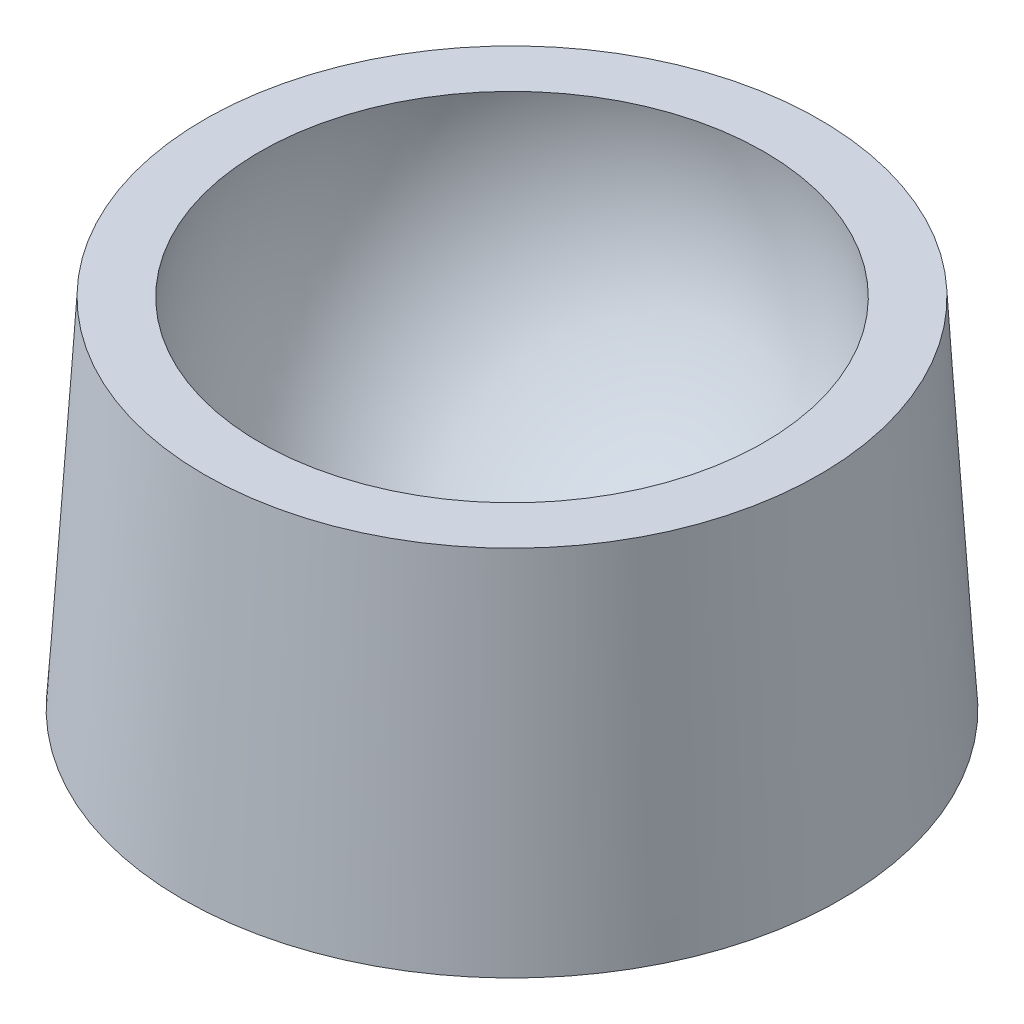
ISO-10303-21;
HEADER;
FILE_DESCRIPTION(('STEP AP214'),'2;1');
FILE_NAME('part.step','',(''),(''),'','','');
FILE_SCHEMA(('AUTOMOTIVE_DESIGN { 1 0 10303 214 1 1 1 1 }'));
ENDSEC;
DATA;
#1=APPLICATION_CONTEXT('core data for automotive mechanical design processes');
#2=APPLICATION_PROTOCOL_DEFINITION('international standard','automotive_design',2000,#1);
#3=PRODUCT_CONTEXT('',#1,'mechanical');
#4=PRODUCT('Part','Part','',(#3));
#5=PRODUCT_RELATED_PRODUCT_CATEGORY('part','',(#4));
#6=PRODUCT_DEFINITION_FORMATION('','',#4);
#7=PRODUCT_DEFINITION_CONTEXT('part definition',#1,'design');
#8=PRODUCT_DEFINITION('design','',#6,#7);
#9=PRODUCT_DEFINITION_SHAPE('','',#8);
#10=(LENGTH_UNIT() NAMED_UNIT(*) SI_UNIT(.MILLI.,.METRE.));
#11=(NAMED_UNIT(*) PLANE_ANGLE_UNIT() SI_UNIT($,.RADIAN.));
#12=(NAMED_UNIT(*) SI_UNIT($,.STERADIAN.) SOLID_ANGLE_UNIT());
#13=UNCERTAINTY_MEASURE_WITH_UNIT(LENGTH_MEASURE(1.E-05),#10,'distance_accuracy_value','');
#14=(GEOMETRIC_REPRESENTATION_CONTEXT(3) GLOBAL_UNCERTAINTY_ASSIGNED_CONTEXT((#13)) GLOBAL_UNIT_ASSIGNED_CONTEXT((#10,
#11,#12)) REPRESENTATION_CONTEXT('',''));
#15=CARTESIAN_POINT('',(0.,0.,0.));
#16=DIRECTION('',(0.,0.,1.));
#17=DIRECTION('',(1.,0.,0.));
#18=AXIS2_PLACEMENT_3D('',#15,#16,#17);
#19=CARTESIAN_POINT('',(0.,1.28430248052422,0.));
#20=DIRECTION('',(0.,-1.,0.));
#21=DIRECTION('',(0.,0.,-1.));
#22=AXIS2_PLACEMENT_3D('',#19,#20,#21);
#23=CONICAL_SURFACE('',#22,12.8962284037218,0.0610865238198008);
#24=CARTESIAN_POINT('',(0.,14.9849999999821,0.));
#25=DIRECTION('',(0.,1.,0.));
#26=DIRECTION('',(0.,0.,1.));
#27=AXIS2_PLACEMENT_3D('',#24,#25,#26);
#28=CIRCLE('',#27,12.0582578455425);
#29=CARTESIAN_POINT('',(0.,14.9849999999821,12.0582578455425));
#30=VERTEX_POINT('',#29);
#31=EDGE_CURVE('E10',#30,#30,#28,.T.);
#32=ORIENTED_EDGE('',*,*,#31,.F.);
#33=EDGE_LOOP('',(#32));
#34=FACE_BOUND('',#33,.T.);
#35=CARTESIAN_POINT('',(0.,0.999000000001801,0.));
#36=DIRECTION('',(0.,1.,0.));
#37=DIRECTION('',(0.,0.,1.));
#38=AXIS2_PLACEMENT_3D('',#35,#36,#37);
#39=CIRCLE('',#38,12.913678250966);
#40=CARTESIAN_POINT('',(0.,0.999000000001801,12.913678250966));
#41=VERTEX_POINT('',#40);
#42=EDGE_CURVE('E58',#41,#41,#39,.T.);
#43=ORIENTED_EDGE('',*,*,#42,.T.);
#44=EDGE_LOOP('',(#43));
#45=FACE_BOUND('',#44,.T.);
#46=ADVANCED_FACE('F30',(#34,#45),#23,.T.);
#47=CARTESIAN_POINT('',(0.,14.9849999999821,-12.0582578455425));
#48=DIRECTION('',(0.,-1.,0.));
#49=DIRECTION('',(0.,0.,-1.));
#50=AXIS2_PLACEMENT_3D('',#47,#48,#49);
#51=PLANE('',#50);
#52=CARTESIAN_POINT('',(0.,14.9849999999821,0.));
#53=DIRECTION('',(0.,1.,0.));
#54=DIRECTION('',(0.,0.,1.));
#55=AXIS2_PLACEMENT_3D('',#52,#53,#54);
#56=CIRCLE('',#55,9.87697310667983);
#57=CARTESIAN_POINT('',(0.,14.9849999999821,-9.87697310667983));
#58=VERTEX_POINT('',#57);
#59=EDGE_CURVE('E36',#58,#58,#56,.T.);
#60=ORIENTED_EDGE('',*,*,#59,.F.);
#61=EDGE_LOOP('',(#60));
#62=FACE_BOUND('',#61,.T.);
#63=ORIENTED_EDGE('',*,*,#31,.T.);
#64=EDGE_LOOP('',(#63));
#65=FACE_BOUND('',#64,.T.);
#66=ADVANCED_FACE('F90',(#62,#65),#51,.F.);
#67=CARTESIAN_POINT('',(0.,13.4864999999987,0.));
#68=DIRECTION('',(0.,1.,0.));
#69=DIRECTION('',(0.,0.,-1.));
#70=AXIS2_PLACEMENT_3D('',#67,#68,#69);
#71=SPHERICAL_SURFACE('',#70,9.99000000000141);
#72=CARTESIAN_POINT('',(0.,4.18040562255126,0.));
#73=DIRECTION('',(0.,1.,0.));
#74=DIRECTION('',(0.,0.,1.));
#75=AXIS2_PLACEMENT_3D('',#72,#73,#74);
#76=CIRCLE('',#75,3.63272727273429);
#77=CARTESIAN_POINT('',(0.,4.18040562255126,-3.63272727273437));
#78=VERTEX_POINT('',#77);
#79=EDGE_CURVE('E40',#78,#78,#76,.T.);
#80=CARTESIAN_POINT('',(0.,4.18040562255126,-3.63272727273437));
#81=CARTESIAN_POINT('',(0.,4.23145869768435,-3.76351705111636));
#82=CARTESIAN_POINT('',(0.,4.28527236509167,-3.89322905653459));
#83=CARTESIAN_POINT('',(0.,4.3983176410626,-4.15027031110503));
#84=CARTESIAN_POINT('',(0.,4.45754924962622,-4.27759956025725));
#85=CARTESIAN_POINT('',(0.,4.58132716451756,-4.52964809195718));
#86=CARTESIAN_POINT('',(0.,4.64587347084529,-4.6543673745049));
#87=CARTESIAN_POINT('',(0.,4.78016551120037,-4.90097453641538));
#88=CARTESIAN_POINT('',(0.,4.84991124522772,-5.02286241577814));
#89=CARTESIAN_POINT('',(0.,4.99447832083373,-5.26359006321421));
#90=CARTESIAN_POINT('',(0.,5.06929966241239,-5.38242983128751));
#91=CARTESIAN_POINT('',(0.,5.22388492631585,-5.61685004723613));
#92=CARTESIAN_POINT('',(0.,5.30364884864066,-5.73243049511145));
#93=CARTESIAN_POINT('',(0.,5.46797751191462,-5.96012663304905));
#94=CARTESIAN_POINT('',(0.,5.55254225286377,-6.07224232311134));
#95=CARTESIAN_POINT('',(0.,5.72632224497564,-6.29280967192739));
#96=CARTESIAN_POINT('',(0.,5.81553749613836,-6.40126133068115));
#97=CARTESIAN_POINT('',(0.,5.99845993800107,-6.61430785427646));
#98=CARTESIAN_POINT('',(0.,6.09216712870107,-6.718902719118));
#99=CARTESIAN_POINT('',(0.,6.28390689402158,-6.9240497477811));
#100=CARTESIAN_POINT('',(0.,6.3819394686421,-7.02460191160266));
#101=CARTESIAN_POINT('',(0.,6.58215575849366,-7.22148481651328));
#102=CARTESIAN_POINT('',(0.,6.68433947372471,-7.31781555760233));
#103=CARTESIAN_POINT('',(0.,6.89267642317018,-7.50608439853376));
#104=CARTESIAN_POINT('',(0.,6.99882965738461,-7.59802249837614));
#105=CARTESIAN_POINT('',(0.,7.21491696775428,-7.77734264578445));
#106=CARTESIAN_POINT('',(0.,7.32485104390952,-7.86472469335038));
#107=CARTESIAN_POINT('',(0.,7.54830464103458,-8.03477742311787));
#108=CARTESIAN_POINT('',(0.,7.6618241620044,-8.11744810531943));
#109=CARTESIAN_POINT('',(0.,7.89224687885438,-8.27793116526323));
#110=CARTESIAN_POINT('',(0.,8.00915007473455,-8.35574354300548));
#111=CARTESIAN_POINT('',(0.,8.24613235734765,-8.50637169009942));
#112=CARTESIAN_POINT('',(0.,8.3662114440806,-8.5791874594511));
#113=CARTESIAN_POINT('',(0.,8.60933207950477,-8.71969296681792));
#114=CARTESIAN_POINT('',(0.,8.73237362819601,-8.78738270483305));
#115=CARTESIAN_POINT('',(0.,8.98120049315435,-8.91751583760282));
#116=CARTESIAN_POINT('',(0.,9.10698580942146,-8.97995923235745));
#117=CARTESIAN_POINT('',(0.,9.36107663836916,-9.0994886915469));
#118=CARTESIAN_POINT('',(0.,9.48938215104977,-9.15657475598171));
#119=CARTESIAN_POINT('',(0.,9.74828532225821,-9.26528808960605));
#120=CARTESIAN_POINT('',(0.,9.87888298078605,-9.31691535879557));
#121=CARTESIAN_POINT('',(0.,10.1421383190563,-9.41461933947987));
#122=CARTESIAN_POINT('',(0.,10.2747959987987,-9.46069605097465));
#123=CARTESIAN_POINT('',(0.,10.5419355933787,-9.54721701940168));
#124=CARTESIAN_POINT('',(0.,10.6764175082163,-9.58766127633393));
#125=CARTESIAN_POINT('',(0.,10.9469665444646,-9.66284544988819));
#126=CARTESIAN_POINT('',(0.,11.0830336658754,-9.69758536651019));
#127=CARTESIAN_POINT('',(0.,11.3565112692059,-9.76129911268063));
#128=CARTESIAN_POINT('',(0.,11.4939217511256,-9.79027294222907));
#129=CARTESIAN_POINT('',(0.,11.7698418416868,-9.84240301586997));
#130=CARTESIAN_POINT('',(0.,11.9083514503282,-9.86555925996243));
#131=CARTESIAN_POINT('',(0.,12.1862236070676,-9.90601300553825));
#132=CARTESIAN_POINT('',(0.,12.3255861551656,-9.92331050702161));
#133=CARTESIAN_POINT('',(0.,12.604916487115,-9.95201601970057));
#134=CARTESIAN_POINT('',(0.,12.7448842709664,-9.96342403089617));
#135=CARTESIAN_POINT('',(0.,13.0251762965435,-9.98033029776205));
#136=CARTESIAN_POINT('',(0.,13.1655005382694,-9.98582855343233));
#137=CARTESIAN_POINT('',(0.,13.4462560622804,-9.99090549411563));
#138=CARTESIAN_POINT('',(0.,13.5866873445655,-9.99048417912864));
#139=CARTESIAN_POINT('',(0.,13.8674073640222,-9.98372288602098));
#140=CARTESIAN_POINT('',(0.,14.0076961011938,-9.97738290790032));
#141=CARTESIAN_POINT('',(0.,14.2878816163917,-9.95879496502824));
#142=CARTESIAN_POINT('',(0.,14.4277783944181,-9.94654700027684));
#143=CARTESIAN_POINT('',(0.,14.7069315789422,-9.91616706379734));
#144=CARTESIAN_POINT('',(0.,14.8461879854401,-9.89803509206925));
#145=CARTESIAN_POINT('',(0.,14.9849999999821,-9.87697310667983));
#146=B_SPLINE_CURVE_WITH_KNOTS('',3,(#80,#81,#82,#83,#84,#85,#86,#87,#88,#89,#90,#91,#92,#93,
#94,#95,#96,#97,#98,#99,#100,#101,#102,#103,#104,#105,#106,#107,#108,#109,#110,#111,#112,#113,
#114,#115,#116,#117,#118,#119,#120,#121,#122,#123,#124,#125,#126,#127,#128,#129,#130,#131,#132,
#133,#134,#135,#136,#137,#138,#139,#140,#141,#142,#143,#144,#145),.UNSPECIFIED.,.F.,.F.,(4,2,2,
2,2,2,2,2,2,2,2,2,2,2,2,2,2,2,2,2,2,2,2,2,2,2,2,2,2,2,2,2,4),(0.,0.421170949227577,
0.842341898455154,1.26351284768273,1.68468379691031,2.10585474613789,2.52702569536546,
2.94819664459304,3.36936759382062,3.7905385430482,4.21170949227577,4.63288044150335,
5.05405139073093,5.4752223399585,5.89639328918608,6.31756423841366,6.73873518764124,
7.15990613686881,7.58107708609639,8.00224803532397,8.42341898455154,8.84458993377912,
9.2657608830067,9.68693183223428,10.1081027814619,10.5292737306894,10.950444679917,
11.3716156291446,11.7927865783722,12.2139575275997,12.6351284768273,13.0562994260549,
13.4774703752825),.UNSPECIFIED.);
#147=EDGE_CURVE('BSEAM95',#78,#58,#146,.T.);
#148=ORIENTED_EDGE('',*,*,#79,.F.);
#149=ORIENTED_EDGE('',*,*,#59,.T.);
#150=ORIENTED_EDGE('',*,*,#147,.T.);
#151=ORIENTED_EDGE('',*,*,#147,.F.);
#152=EDGE_LOOP('',(#148,#150,#149,#151));
#153=FACE_BOUND('',#152,.T.);
#154=ADVANCED_FACE('F95',(#153),#71,.F.);
#155=CARTESIAN_POINT('',(0.,3.2497961848058,0.));
#156=DIRECTION('',(0.,1.,0.));
#157=DIRECTION('',(0.,0.,1.));
#158=AXIS2_PLACEMENT_3D('',#155,#156,#157);
#159=TOROIDAL_SURFACE('',#158,3.99600000000777,0.99900000000082);
#160=CARTESIAN_POINT('',(0.,3.24979618482436,0.));
#161=DIRECTION('',(0.,1.,0.));
#162=DIRECTION('',(0.,0.,1.));
#163=AXIS2_PLACEMENT_3D('',#160,#161,#162);
#164=CIRCLE('',#163,2.99700000000686);
#165=CARTESIAN_POINT('',(0.,3.24979618482436,2.99700000000686));
#166=VERTEX_POINT('',#165);
#167=EDGE_CURVE('E44',#166,#166,#164,.T.);
#168=ORIENTED_EDGE('',*,*,#167,.F.);
#169=EDGE_LOOP('',(#168));
#170=FACE_BOUND('',#169,.T.);
#171=ORIENTED_EDGE('',*,*,#79,.T.);
#172=EDGE_LOOP('',(#171));
#173=FACE_BOUND('',#172,.T.);
#174=ADVANCED_FACE('F103',(#170,#173),#159,.T.);
#175=CARTESIAN_POINT('',(0.,1.49849999997262,0.));
#176=DIRECTION('',(0.,1.,0.));
#177=DIRECTION('',(0.,0.,1.));
#178=AXIS2_PLACEMENT_3D('',#175,#176,#177);
#179=CYLINDRICAL_SURFACE('',#178,2.99700000000686);
#180=CARTESIAN_POINT('',(0.,1.49849999997262,0.));
#181=DIRECTION('',(0.,1.,0.));
#182=DIRECTION('',(0.,0.,1.));
#183=AXIS2_PLACEMENT_3D('',#180,#181,#182);
#184=CIRCLE('',#183,2.99700000000686);
#185=CARTESIAN_POINT('',(0.,1.49849999997262,2.99700000000686));
#186=VERTEX_POINT('',#185);
#187=EDGE_CURVE('E49',#186,#186,#184,.T.);
#188=ORIENTED_EDGE('',*,*,#187,.F.);
#189=EDGE_LOOP('',(#188));
#190=FACE_BOUND('',#189,.T.);
#191=ORIENTED_EDGE('',*,*,#167,.T.);
#192=EDGE_LOOP('',(#191));
#193=FACE_BOUND('',#192,.T.);
#194=ADVANCED_FACE('F109',(#190,#193),#179,.F.);
#195=CARTESIAN_POINT('',(0.,1.49849999997262,-1.24875000000325));
#196=DIRECTION('',(0.,-1.,0.));
#197=DIRECTION('',(0.,0.,-1.));
#198=AXIS2_PLACEMENT_3D('',#195,#196,#197);
#199=PLANE('',#198);
#200=CARTESIAN_POINT('',(0.,1.49849999997262,0.));
#201=DIRECTION('',(0.,-1.,0.));
#202=DIRECTION('',(0.,0.,-1.));
#203=AXIS2_PLACEMENT_3D('',#200,#201,#202);
#204=CIRCLE('',#203,1.25);
#205=CARTESIAN_POINT('',(0.,1.49849999997262,-1.25));
#206=VERTEX_POINT('',#205);
#207=EDGE_CURVE('E61',#206,#206,#204,.T.);
#208=ORIENTED_EDGE('',*,*,#207,.T.);
#209=EDGE_LOOP('',(#208));
#210=FACE_BOUND('',#209,.T.);
#211=ORIENTED_EDGE('',*,*,#187,.T.);
#212=EDGE_LOOP('',(#211));
#213=FACE_BOUND('',#212,.T.);
#214=ADVANCED_FACE('F75',(#210,#213),#199,.F.);
#215=CARTESIAN_POINT('',(0.,0.,-1.24875000000325));
#216=DIRECTION('',(0.,1.,0.));
#217=DIRECTION('',(0.,0.,1.));
#218=AXIS2_PLACEMENT_3D('',#215,#216,#217);
#219=PLANE('',#218);
#220=CARTESIAN_POINT('',(0.,0.,0.));
#221=DIRECTION('',(0.,-1.,0.));
#222=DIRECTION('',(0.,0.,-1.));
#223=AXIS2_PLACEMENT_3D('',#220,#221,#222);
#224=CIRCLE('',#223,1.25);
#225=CARTESIAN_POINT('',(0.,0.,-1.25));
#226=VERTEX_POINT('',#225);
#227=EDGE_CURVE('E64',#226,#226,#224,.T.);
#228=ORIENTED_EDGE('',*,*,#227,.F.);
#229=EDGE_LOOP('',(#228));
#230=FACE_BOUND('',#229,.T.);
#231=CARTESIAN_POINT('',(0.,0.,0.));
#232=DIRECTION('',(0.,1.,0.));
#233=DIRECTION('',(0.,0.,1.));
#234=AXIS2_PLACEMENT_3D('',#231,#232,#233);
#235=CIRCLE('',#234,4.86865585844174);
#236=CARTESIAN_POINT('',(0.,0.,-4.86865585844174));
#237=VERTEX_POINT('',#236);
#238=EDGE_CURVE('E52',#237,#237,#235,.T.);
#239=ORIENTED_EDGE('',*,*,#238,.F.);
#240=EDGE_LOOP('',(#239));
#241=FACE_BOUND('',#240,.T.);
#242=ADVANCED_FACE('F71',(#230,#241),#219,.F.);
#243=CARTESIAN_POINT('',(0.,13.11123129733,3.3211280947576E-12));
#244=DIRECTION('',(0.,1.,0.));
#245=DIRECTION('',(0.,0.,-1.));
#246=AXIS2_PLACEMENT_3D('',#243,#244,#245);
#247=SPHERICAL_SURFACE('',#246,13.9860000000021);
#248=CARTESIAN_POINT('',(0.,0.999000000001801,0.));
#249=DIRECTION('',(0.,1.,0.));
#250=DIRECTION('',(0.,0.,1.));
#251=AXIS2_PLACEMENT_3D('',#248,#249,#250);
#252=CIRCLE('',#251,6.99300000000244);
#253=CARTESIAN_POINT('',(0.,0.999000000001799,-6.99300000000243));
#254=VERTEX_POINT('',#253);
#255=EDGE_CURVE('E55',#254,#254,#252,.T.);
#256=CARTESIAN_POINT('',(0.,0.999000000001799,-6.99300000000243));
#257=CARTESIAN_POINT('',(0.,0.986758946951357,-6.97179787545418));
#258=CARTESIAN_POINT('',(0.,0.974573565583738,-6.95056360885154));
#259=CARTESIAN_POINT('',(0.,0.95031447982532,-6.90803137850695));
#260=CARTESIAN_POINT('',(0.,0.93824077543452,-6.886733414765));
#261=CARTESIAN_POINT('',(0.,0.914205377240912,-6.84407437711121));
#262=CARTESIAN_POINT('',(0.,0.902243683438104,-6.82271330319938));
#263=CARTESIAN_POINT('',(0.,0.878432636117488,-6.77992863438636));
#264=CARTESIAN_POINT('',(0.,0.86658328259968,-6.75850503948517));
#265=CARTESIAN_POINT('',(0.,0.842997242669141,-6.715595919472));
#266=CARTESIAN_POINT('',(0.,0.83126055625641,-6.69411039436002));
#267=CARTESIAN_POINT('',(0.,0.807900174189801,-6.65107800644551));
#268=CARTESIAN_POINT('',(0.,0.796276478535922,-6.62953114364298));
#269=CARTESIAN_POINT('',(0.,0.773142398540686,-6.58637667455005));
#270=CARTESIAN_POINT('',(0.,0.761632014199328,-6.56476906825966));
#271=CARTESIAN_POINT('',(0.,0.738724874253727,-6.5214937080713));
#272=CARTESIAN_POINT('',(0.,0.727328118649484,-6.49982595417333));
#273=CARTESIAN_POINT('',(0.,0.704648550470267,-6.45643089630813));
#274=CARTESIAN_POINT('',(0.,0.693365737895294,-6.43470359234091));
#275=CARTESIAN_POINT('',(0.,0.670914366924229,-6.39119003351795));
#276=CARTESIAN_POINT('',(0.,0.659745808528137,-6.36940377866222));
#277=CARTESIAN_POINT('',(0.,0.637523253913699,-6.32577291886863));
#278=CARTESIAN_POINT('',(0.,0.626469257695354,-6.30392831393077));
#279=CARTESIAN_POINT('',(0.,0.604476132275939,-6.2601813563885));
#280=CARTESIAN_POINT('',(0.,0.593537003074869,-6.23827900378408));
#281=CARTESIAN_POINT('',(0.,0.571773913361817,-6.19441715491675));
#282=CARTESIAN_POINT('',(0.,0.560949952849834,-6.17245765865383));
#283=CARTESIAN_POINT('',(0.,0.53941749901072,-6.12848212805344));
#284=CARTESIAN_POINT('',(0.,0.528709005683588,-6.10646609371597));
#285=CARTESIAN_POINT('',(0.,0.507407781525665,-6.06237809410957));
#286=CARTESIAN_POINT('',(0.,0.496815050694875,-6.04030612884065));
#287=CARTESIAN_POINT('',(0.,0.475745643648712,-5.99610687605689));
#288=CARTESIAN_POINT('',(0.,0.465268967433339,-5.97397958854206));
#289=CARTESIAN_POINT('',(0.,0.444431958536603,-5.92967030147764));
#290=CARTESIAN_POINT('',(0.,0.43407162585524,-5.90748830192806));
#291=CARTESIAN_POINT('',(0.,0.413467589736681,-5.86307020251415));
#292=CARTESIAN_POINT('',(0.,0.403223886299486,-5.84083410264981));
#293=CARTESIAN_POINT('',(0.,0.382853391163098,-5.7963084158183));
#294=CARTESIAN_POINT('',(0.,0.372726599463905,-5.77401882885112));
#295=CARTESIAN_POINT('',(0.,0.352590207073241,-5.7293867825009));
#296=CARTESIAN_POINT('',(0.,0.342580606381771,-5.70704432311784));
#297=CARTESIAN_POINT('',(0.,0.322678872044463,-5.6623071480809));
#298=CARTESIAN_POINT('',(0.,0.312786738398625,-5.639912432427));
#299=CARTESIAN_POINT('',(0.,0.293120210951064,-5.59507136243448));
#300=CARTESIAN_POINT('',(0.,0.28334581714934,-5.57262500809586));
#301=CARTESIAN_POINT('',(0.,0.263915038941546,-5.52768127974408));
#302=CARTESIAN_POINT('',(0.,0.254258654535476,-5.50518390573092));
#303=CARTESIAN_POINT('',(0.,0.235064161416122,-5.46013875844721));
#304=CARTESIAN_POINT('',(0.,0.225526052702838,-5.43759098517667));
#305=CARTESIAN_POINT('',(0.,0.206568374004554,-5.39244566118523));
#306=CARTESIAN_POINT('',(0.,0.197148804019554,-5.36984811046433));
#307=CARTESIAN_POINT('',(0.,0.178428462544021,-5.32460385475204));
#308=CARTESIAN_POINT('',(0.,0.169127691053488,-5.30195714976065));
#309=CARTESIAN_POINT('',(0.,0.150645203058164,-5.25661521004232));
#310=CARTESIAN_POINT('',(0.,0.141463486553372,-5.23391997531538));
#311=CARTESIAN_POINT('',(0.,0.123219361733002,-5.18848160200094));
#312=CARTESIAN_POINT('',(0.,0.114156953417424,-5.16573846341345));
#313=CARTESIAN_POINT('',(0.,0.0961516949058523,-5.12020490956751));
#314=CARTESIAN_POINT('',(0.,0.0872088447098592,-5.09741449430907));
#315=CARTESIAN_POINT('',(0.,0.0694429490069211,-5.05178701563868));
#316=CARTESIAN_POINT('',(0.,0.0606199034999762,-5.02894995222673));
#317=CARTESIAN_POINT('',(0.,0.0430938606788743,-4.98322980696334));
#318=CARTESIAN_POINT('',(0.,0.0343908633647174,-4.9603467251119));
#319=CARTESIAN_POINT('',(0.,0.0171051562334788,-4.91453517428798));
#320=CARTESIAN_POINT('',(0.,0.00852244641639709,-4.89160670531551));
#321=CARTESIAN_POINT('',(0.,0.,-4.86865585844174));
#322=B_SPLINE_CURVE_WITH_KNOTS('',3,(#256,#257,#258,#259,#260,#261,#262,#263,#264,#265,#266,
#267,#268,#269,#270,#271,#272,#273,#274,#275,#276,#277,#278,#279,#280,#281,#282,#283,#284,#285,
#286,#287,#288,#289,#290,#291,#292,#293,#294,#295,#296,#297,#298,#299,#300,#301,#302,#303,#304,
#305,#306,#307,#308,#309,#310,#311,#312,#313,#314,#315,#316,#317,#318,#319,#320,#321),
.UNSPECIFIED.,.F.,.F.,(4,2,2,2,2,2,2,2,2,2,2,2,2,2,2,2,2,2,2,2,2,2,2,2,2,2,2,2,2,2,2,2,4),(0.,
0.073446230590918,0.146892461181835,0.220338691772753,0.293784922363671,0.367231152954586,
0.440677383545503,0.514123614136422,0.587569844727339,0.661016075318257,0.734462305909174,
0.807908536500093,0.881354767091008,0.954800997681925,1.02824722827284,1.10169345886376,
1.17513968945468,1.2485859200456,1.32203215063651,1.39547838122743,1.46892461181835,
1.54237084240926,1.61581707300018,1.6892633035911,1.76270953418202,1.83615576477293,
1.90960199536385,1.98304822595477,2.05649445654569,2.1299406871366,2.20338691772752,
2.27683314831844,2.35027937890936),.UNSPECIFIED.);
#323=EDGE_CURVE('BSEAM74',#254,#237,#322,.T.);
#324=ORIENTED_EDGE('',*,*,#255,.F.);
#325=ORIENTED_EDGE('',*,*,#238,.T.);
#326=ORIENTED_EDGE('',*,*,#323,.T.);
#327=ORIENTED_EDGE('',*,*,#323,.F.);
#328=EDGE_LOOP('',(#324,#326,#325,#327));
#329=FACE_BOUND('',#328,.T.);
#330=ADVANCED_FACE('F74',(#329),#247,.T.);
#331=CARTESIAN_POINT('',(0.,0.999000000001801,-11.8387449808993));
#332=DIRECTION('',(0.,1.,0.));
#333=DIRECTION('',(0.,0.,1.));
#334=AXIS2_PLACEMENT_3D('',#331,#332,#333);
#335=PLANE('',#334);
#336=ORIENTED_EDGE('',*,*,#42,.F.);
#337=EDGE_LOOP('',(#336));
#338=FACE_BOUND('',#337,.T.);
#339=ORIENTED_EDGE('',*,*,#255,.T.);
#340=EDGE_LOOP('',(#339));
#341=FACE_BOUND('',#340,.T.);
#342=ADVANCED_FACE('F80',(#338,#341),#335,.F.);
#343=CARTESIAN_POINT('',(0.,10.,0.));
#344=DIRECTION('',(0.,-1.,0.));
#345=DIRECTION('',(0.,0.,-1.));
#346=AXIS2_PLACEMENT_3D('',#343,#344,#345);
#347=CYLINDRICAL_SURFACE('',#346,1.25);
#348=ORIENTED_EDGE('',*,*,#227,.T.);
#349=EDGE_LOOP('',(#348));
#350=FACE_BOUND('',#349,.T.);
#351=ORIENTED_EDGE('',*,*,#207,.F.);
#352=EDGE_LOOP('',(#351));
#353=FACE_BOUND('',#352,.T.);
#354=ADVANCED_FACE('F68',(#350,#353),#347,.F.);
#355=CLOSED_SHELL('',(#46,#66,#154,#174,#194,#214,#242,#330,#342,#354));
#356=MANIFOLD_SOLID_BREP('B2',#355);
#357=ADVANCED_BREP_SHAPE_REPRESENTATION('',(#18,#356),#14);
#358=SHAPE_DEFINITION_REPRESENTATION(#9,#357);
ENDSEC;
END-ISO-10303-21;
